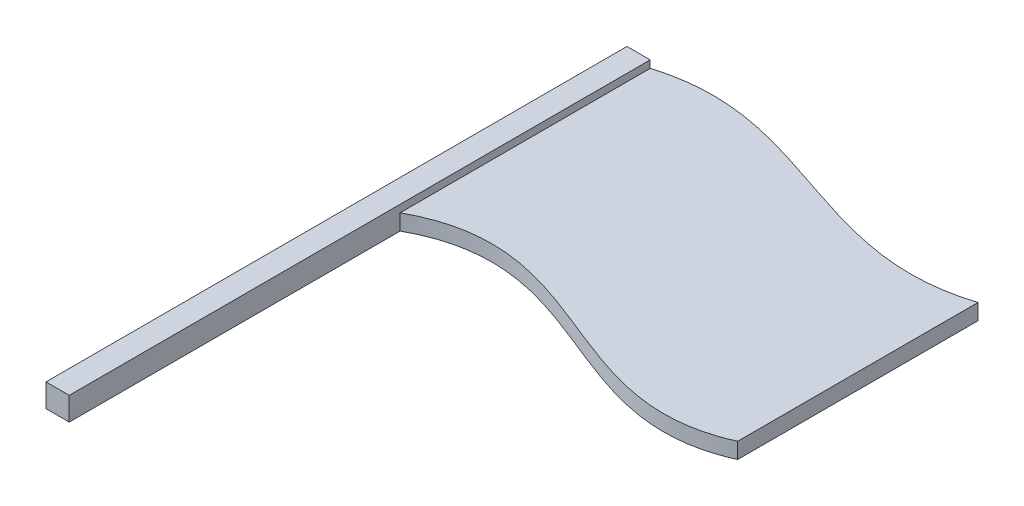
ISO-10303-21;
HEADER;
FILE_DESCRIPTION(('STEP AP214'),'2;1');
FILE_NAME('part.step','',(''),(''),'','','');
FILE_SCHEMA(('AUTOMOTIVE_DESIGN { 1 0 10303 214 1 1 1 1 }'));
ENDSEC;
DATA;
#1=APPLICATION_CONTEXT('core data for automotive mechanical design processes');
#2=APPLICATION_PROTOCOL_DEFINITION('international standard','automotive_design',2000,#1);
#3=PRODUCT_CONTEXT('',#1,'mechanical');
#4=PRODUCT('Part','Part','',(#3));
#5=PRODUCT_RELATED_PRODUCT_CATEGORY('part','',(#4));
#6=PRODUCT_DEFINITION_FORMATION('','',#4);
#7=PRODUCT_DEFINITION_CONTEXT('part definition',#1,'design');
#8=PRODUCT_DEFINITION('design','',#6,#7);
#9=PRODUCT_DEFINITION_SHAPE('','',#8);
#10=(LENGTH_UNIT() NAMED_UNIT(*) SI_UNIT(.MILLI.,.METRE.));
#11=(NAMED_UNIT(*) PLANE_ANGLE_UNIT() SI_UNIT($,.RADIAN.));
#12=(NAMED_UNIT(*) SI_UNIT($,.STERADIAN.) SOLID_ANGLE_UNIT());
#13=UNCERTAINTY_MEASURE_WITH_UNIT(LENGTH_MEASURE(1.E-05),#10,'distance_accuracy_value','');
#14=(GEOMETRIC_REPRESENTATION_CONTEXT(3) GLOBAL_UNCERTAINTY_ASSIGNED_CONTEXT((#13)) GLOBAL_UNIT_ASSIGNED_CONTEXT((#10,
#11,#12)) REPRESENTATION_CONTEXT('',''));
#15=CARTESIAN_POINT('',(0.,0.,0.));
#16=DIRECTION('',(0.,0.,1.));
#17=DIRECTION('',(1.,0.,0.));
#18=AXIS2_PLACEMENT_3D('',#15,#16,#17);
#19=CARTESIAN_POINT('',(2.2,2.2,0.));
#20=DIRECTION('',(-1.,0.,0.));
#21=DIRECTION('',(0.,0.,1.));
#22=AXIS2_PLACEMENT_3D('',#19,#20,#21);
#23=PLANE('',#22);
#24=DIRECTION('',(0.,-1.,0.));
#25=VECTOR('',#24,1.);
#26=CARTESIAN_POINT('',(2.2,1.5,-31.323116724792));
#27=LINE('',#26,#25);
#28=CARTESIAN_POINT('',(2.2,1.5,-31.323116724792));
#29=VERTEX_POINT('',#28);
#30=CARTESIAN_POINT('',(2.2,0.,-31.323116724792));
#31=VERTEX_POINT('',#30);
#32=EDGE_CURVE('E104',#29,#31,#27,.T.);
#33=ORIENTED_EDGE('',*,*,#32,.F.);
#34=DIRECTION('',(0.,0.,1.));
#35=VECTOR('',#34,1.);
#36=CARTESIAN_POINT('',(2.2,1.5,-55.));
#37=LINE('',#36,#35);
#38=CARTESIAN_POINT('',(2.2,1.5,-55.));
#39=VERTEX_POINT('',#38);
#40=EDGE_CURVE('E59',#39,#29,#37,.T.);
#41=ORIENTED_EDGE('',*,*,#40,.F.);
#42=DIRECTION('',(0.,-1.,0.));
#43=VECTOR('',#42,1.);
#44=CARTESIAN_POINT('',(2.2,2.2,-55.));
#45=LINE('',#44,#43);
#46=CARTESIAN_POINT('',(2.2,2.2,-55.));
#47=VERTEX_POINT('',#46);
#48=EDGE_CURVE('E208',#47,#39,#45,.T.);
#49=ORIENTED_EDGE('',*,*,#48,.F.);
#50=DIRECTION('',(0.,0.,-1.));
#51=VECTOR('',#50,1.);
#52=CARTESIAN_POINT('',(2.2,2.2,0.));
#53=LINE('',#52,#51);
#54=CARTESIAN_POINT('',(2.2,2.2,0.));
#55=VERTEX_POINT('',#54);
#56=EDGE_CURVE('E188',#55,#47,#53,.T.);
#57=ORIENTED_EDGE('',*,*,#56,.F.);
#58=DIRECTION('',(0.,-1.,0.));
#59=VECTOR('',#58,1.);
#60=CARTESIAN_POINT('',(2.2,2.2,0.));
#61=LINE('',#60,#59);
#62=CARTESIAN_POINT('',(2.2,0.,0.));
#63=VERTEX_POINT('',#62);
#64=EDGE_CURVE('E52',#55,#63,#61,.T.);
#65=ORIENTED_EDGE('',*,*,#64,.T.);
#66=DIRECTION('',(0.,0.,-1.));
#67=VECTOR('',#66,1.);
#68=CARTESIAN_POINT('',(2.2,0.,0.));
#69=LINE('',#68,#67);
#70=EDGE_CURVE('E65',#63,#31,#69,.T.);
#71=ORIENTED_EDGE('',*,*,#70,.T.);
#72=EDGE_LOOP('',(#33,#41,#49,#57,#65,#71));
#73=FACE_BOUND('',#72,.T.);
#74=ADVANCED_FACE('F43',(#73),#23,.F.);
#75=CARTESIAN_POINT('',(0.,2.2,0.));
#76=DIRECTION('',(1.,0.,0.));
#77=DIRECTION('',(0.,0.,-1.));
#78=AXIS2_PLACEMENT_3D('',#75,#76,#77);
#79=PLANE('',#78);
#80=DIRECTION('',(0.,0.,1.));
#81=VECTOR('',#80,1.);
#82=CARTESIAN_POINT('',(0.,0.,0.));
#83=LINE('',#82,#81);
#84=CARTESIAN_POINT('',(0.,0.,-55.));
#85=VERTEX_POINT('',#84);
#86=CARTESIAN_POINT('',(0.,0.,0.));
#87=VERTEX_POINT('',#86);
#88=EDGE_CURVE('E179',#85,#87,#83,.T.);
#89=ORIENTED_EDGE('',*,*,#88,.T.);
#90=DIRECTION('',(0.,-1.,0.));
#91=VECTOR('',#90,1.);
#92=CARTESIAN_POINT('',(0.,2.2,0.));
#93=LINE('',#92,#91);
#94=CARTESIAN_POINT('',(0.,2.2,0.));
#95=VERTEX_POINT('',#94);
#96=EDGE_CURVE('E11',#95,#87,#93,.T.);
#97=ORIENTED_EDGE('',*,*,#96,.F.);
#98=DIRECTION('',(0.,0.,1.));
#99=VECTOR('',#98,1.);
#100=CARTESIAN_POINT('',(0.,2.2,0.));
#101=LINE('',#100,#99);
#102=CARTESIAN_POINT('',(0.,2.2,-55.));
#103=VERTEX_POINT('',#102);
#104=EDGE_CURVE('E180',#103,#95,#101,.T.);
#105=ORIENTED_EDGE('',*,*,#104,.F.);
#106=DIRECTION('',(0.,-1.,0.));
#107=VECTOR('',#106,1.);
#108=CARTESIAN_POINT('',(0.,2.2,-55.));
#109=LINE('',#108,#107);
#110=EDGE_CURVE('E194',#103,#85,#109,.T.);
#111=ORIENTED_EDGE('',*,*,#110,.T.);
#112=EDGE_LOOP('',(#89,#97,#105,#111));
#113=FACE_BOUND('',#112,.T.);
#114=ADVANCED_FACE('F45',(#113),#79,.F.);
#115=CARTESIAN_POINT('',(0.,2.2,0.));
#116=DIRECTION('',(0.,0.,-1.));
#117=DIRECTION('',(-1.,0.,0.));
#118=AXIS2_PLACEMENT_3D('',#115,#116,#117);
#119=PLANE('',#118);
#120=DIRECTION('',(1.,0.,0.));
#121=VECTOR('',#120,1.);
#122=CARTESIAN_POINT('',(0.,0.,0.));
#123=LINE('',#122,#121);
#124=EDGE_CURVE('E198',#87,#63,#123,.T.);
#125=ORIENTED_EDGE('',*,*,#124,.T.);
#126=ORIENTED_EDGE('',*,*,#64,.F.);
#127=DIRECTION('',(1.,0.,0.));
#128=VECTOR('',#127,1.);
#129=CARTESIAN_POINT('',(0.,2.2,0.));
#130=LINE('',#129,#128);
#131=EDGE_CURVE('E184',#95,#55,#130,.T.);
#132=ORIENTED_EDGE('',*,*,#131,.F.);
#133=ORIENTED_EDGE('',*,*,#96,.T.);
#134=EDGE_LOOP('',(#125,#126,#132,#133));
#135=FACE_BOUND('',#134,.T.);
#136=ADVANCED_FACE('F227',(#135),#119,.F.);
#137=CARTESIAN_POINT('',(0.,2.2,-55.));
#138=DIRECTION('',(0.,0.,1.));
#139=DIRECTION('',(1.,0.,0.));
#140=AXIS2_PLACEMENT_3D('',#137,#138,#139);
#141=PLANE('',#140);
#142=DIRECTION('',(-1.,0.,0.));
#143=VECTOR('',#142,1.);
#144=CARTESIAN_POINT('',(0.,0.,-55.));
#145=LINE('',#144,#143);
#146=CARTESIAN_POINT('',(2.2,0.,-55.));
#147=VERTEX_POINT('',#146);
#148=EDGE_CURVE('E185',#147,#85,#145,.T.);
#149=ORIENTED_EDGE('',*,*,#148,.T.);
#150=ORIENTED_EDGE('',*,*,#110,.F.);
#151=DIRECTION('',(-1.,0.,0.));
#152=VECTOR('',#151,1.);
#153=CARTESIAN_POINT('',(0.,2.2,-55.));
#154=LINE('',#153,#152);
#155=EDGE_CURVE('E191',#47,#103,#154,.T.);
#156=ORIENTED_EDGE('',*,*,#155,.F.);
#157=ORIENTED_EDGE('',*,*,#48,.T.);
#158=DIRECTION('',(0.,-1.,0.));
#159=VECTOR('',#158,1.);
#160=CARTESIAN_POINT('',(2.2,1.5,-55.));
#161=LINE('',#160,#159);
#162=EDGE_CURVE('E109',#39,#147,#161,.T.);
#163=ORIENTED_EDGE('',*,*,#162,.T.);
#164=EDGE_LOOP('',(#149,#150,#156,#157,#163));
#165=FACE_BOUND('',#164,.T.);
#166=ADVANCED_FACE('F220',(#165),#141,.F.);
#167=CARTESIAN_POINT('',(0.,2.2,0.));
#168=DIRECTION('',(0.,-1.,0.));
#169=DIRECTION('',(0.,0.,-1.));
#170=AXIS2_PLACEMENT_3D('',#167,#168,#169);
#171=PLANE('',#170);
#172=ORIENTED_EDGE('',*,*,#104,.T.);
#173=ORIENTED_EDGE('',*,*,#131,.T.);
#174=ORIENTED_EDGE('',*,*,#56,.T.);
#175=ORIENTED_EDGE('',*,*,#155,.T.);
#176=EDGE_LOOP('',(#172,#173,#174,#175));
#177=FACE_BOUND('',#176,.T.);
#178=ADVANCED_FACE('F150',(#177),#171,.F.);
#179=CARTESIAN_POINT('',(0.,0.,0.));
#180=DIRECTION('',(0.,-1.,0.));
#181=DIRECTION('',(0.,0.,-1.));
#182=AXIS2_PLACEMENT_3D('',#179,#180,#181);
#183=PLANE('',#182);
#184=ORIENTED_EDGE('',*,*,#88,.F.);
#185=ORIENTED_EDGE('',*,*,#148,.F.);
#186=CARTESIAN_POINT('',(36.9061950367362,0.,-51.3261210531367));
#187=CARTESIAN_POINT('',(24.5057977795233,0.,-47.3439413086352));
#188=CARTESIAN_POINT('',(14.2965385767881,0.,-58.7638170369596));
#189=CARTESIAN_POINT('',(2.2,0.,-55.));
#190=B_SPLINE_CURVE_WITH_KNOTS('',3,(#186,#187,#188,#189),.UNSPECIFIED.,.F.,.F.,(4,4),(0.,1.),.UNSPECIFIED.);
#191=CARTESIAN_POINT('',(36.9061950367362,0.,-51.3261210531367));
#192=VERTEX_POINT('',#191);
#193=EDGE_CURVE('E168',#192,#147,#190,.T.);
#194=ORIENTED_EDGE('',*,*,#193,.F.);
#195=DIRECTION('',(0.,0.,-1.));
#196=VECTOR('',#195,1.);
#197=CARTESIAN_POINT('',(36.9061950367362,0.,-51.3261210531367));
#198=LINE('',#197,#196);
#199=CARTESIAN_POINT('',(36.9061950367362,0.,-28.5716533778822));
#200=VERTEX_POINT('',#199);
#201=EDGE_CURVE('E156',#200,#192,#198,.T.);
#202=ORIENTED_EDGE('',*,*,#201,.F.);
#203=CARTESIAN_POINT('',(2.2,0.,-31.323116724792));
#204=CARTESIAN_POINT('',(14.5595057509905,0.,-38.1540172680351));
#205=CARTESIAN_POINT('',(24.656914199335,0.,-23.0362558905574));
#206=CARTESIAN_POINT('',(36.9061950367362,0.,-28.5716533778822));
#207=B_SPLINE_CURVE_WITH_KNOTS('',3,(#203,#204,#205,#206),.UNSPECIFIED.,.F.,.F.,(4,4),(0.,1.),.UNSPECIFIED.);
#208=EDGE_CURVE('E161',#31,#200,#207,.T.);
#209=ORIENTED_EDGE('',*,*,#208,.F.);
#210=ORIENTED_EDGE('',*,*,#70,.F.);
#211=ORIENTED_EDGE('',*,*,#124,.F.);
#212=EDGE_LOOP('',(#184,#185,#194,#202,#209,#210,#211));
#213=FACE_BOUND('',#212,.T.);
#214=ADVANCED_FACE('F148',(#213),#183,.T.);
#215=CARTESIAN_POINT('',(36.9061950367362,1.5,-51.3261210531367));
#216=CARTESIAN_POINT('',(24.5057977795233,1.5,-47.3439413086352));
#217=CARTESIAN_POINT('',(14.2965385767881,1.5,-58.7638170369596));
#218=CARTESIAN_POINT('',(2.2,1.5,-55.));
#219=B_SPLINE_CURVE_WITH_KNOTS('',3,(#215,#216,#217,#218),.UNSPECIFIED.,.F.,.F.,(4,4),(0.,1.),.UNSPECIFIED.);
#220=DIRECTION('',(0.,-1.,0.));
#221=VECTOR('',#220,1.);
#222=SURFACE_OF_LINEAR_EXTRUSION('',#219,#221);
#223=ORIENTED_EDGE('',*,*,#193,.T.);
#224=ORIENTED_EDGE('',*,*,#162,.F.);
#225=CARTESIAN_POINT('',(36.9061950367362,1.5,-51.3261210531367));
#226=VERTEX_POINT('',#225);
#227=EDGE_CURVE('E118',#226,#39,#219,.T.);
#228=ORIENTED_EDGE('',*,*,#227,.F.);
#229=DIRECTION('',(0.,-1.,0.));
#230=VECTOR('',#229,1.);
#231=CARTESIAN_POINT('',(36.9061950367362,1.5,-51.3261210531367));
#232=LINE('',#231,#230);
#233=EDGE_CURVE('E129',#226,#192,#232,.T.);
#234=ORIENTED_EDGE('',*,*,#233,.T.);
#235=EDGE_LOOP('',(#223,#224,#228,#234));
#236=FACE_BOUND('',#235,.T.);
#237=ADVANCED_FACE('F144',(#236),#222,.F.);
#238=CARTESIAN_POINT('',(2.2,1.5,-31.323116724792));
#239=CARTESIAN_POINT('',(14.5595057509905,1.5,-38.1540172680351));
#240=CARTESIAN_POINT('',(24.656914199335,1.5,-23.0362558905574));
#241=CARTESIAN_POINT('',(36.9061950367362,1.5,-28.5716533778822));
#242=B_SPLINE_CURVE_WITH_KNOTS('',3,(#238,#239,#240,#241),.UNSPECIFIED.,.F.,.F.,(4,4),(0.,1.),.UNSPECIFIED.);
#243=DIRECTION('',(0.,-1.,0.));
#244=VECTOR('',#243,1.);
#245=SURFACE_OF_LINEAR_EXTRUSION('',#242,#244);
#246=ORIENTED_EDGE('',*,*,#208,.T.);
#247=DIRECTION('',(0.,-1.,0.));
#248=VECTOR('',#247,1.);
#249=CARTESIAN_POINT('',(36.9061950367362,1.5,-28.5716533778822));
#250=LINE('',#249,#248);
#251=CARTESIAN_POINT('',(36.9061950367362,1.5,-28.5716533778822));
#252=VERTEX_POINT('',#251);
#253=EDGE_CURVE('E110',#252,#200,#250,.T.);
#254=ORIENTED_EDGE('',*,*,#253,.F.);
#255=EDGE_CURVE('E115',#29,#252,#242,.T.);
#256=ORIENTED_EDGE('',*,*,#255,.F.);
#257=ORIENTED_EDGE('',*,*,#32,.T.);
#258=EDGE_LOOP('',(#246,#254,#256,#257));
#259=FACE_BOUND('',#258,.T.);
#260=ADVANCED_FACE('F122',(#259),#245,.F.);
#261=CARTESIAN_POINT('',(36.9061950367362,1.5,-51.3261210531367));
#262=DIRECTION('',(-1.,0.,0.));
#263=DIRECTION('',(0.,0.,1.));
#264=AXIS2_PLACEMENT_3D('',#261,#262,#263);
#265=PLANE('',#264);
#266=ORIENTED_EDGE('',*,*,#201,.T.);
#267=ORIENTED_EDGE('',*,*,#233,.F.);
#268=DIRECTION('',(0.,0.,-1.));
#269=VECTOR('',#268,1.);
#270=CARTESIAN_POINT('',(36.9061950367362,1.5,-51.3261210531367));
#271=LINE('',#270,#269);
#272=EDGE_CURVE('E126',#252,#226,#271,.T.);
#273=ORIENTED_EDGE('',*,*,#272,.F.);
#274=ORIENTED_EDGE('',*,*,#253,.T.);
#275=EDGE_LOOP('',(#266,#267,#273,#274));
#276=FACE_BOUND('',#275,.T.);
#277=ADVANCED_FACE('F143',(#276),#265,.F.);
#278=CARTESIAN_POINT('',(19.4391505132088,1.5,-53.0811745112401));
#279=DIRECTION('',(0.,1.,0.));
#280=DIRECTION('',(0.,0.,1.));
#281=AXIS2_PLACEMENT_3D('',#278,#279,#280);
#282=PLANE('',#281);
#283=ORIENTED_EDGE('',*,*,#227,.T.);
#284=ORIENTED_EDGE('',*,*,#40,.T.);
#285=ORIENTED_EDGE('',*,*,#255,.T.);
#286=ORIENTED_EDGE('',*,*,#272,.T.);
#287=EDGE_LOOP('',(#283,#284,#285,#286));
#288=FACE_BOUND('',#287,.T.);
#289=ADVANCED_FACE('F114',(#288),#282,.T.);
#290=CLOSED_SHELL('',(#74,#114,#136,#166,#178,#214,#237,#260,#277,#289));
#291=MANIFOLD_SOLID_BREP('B2',#290);
#292=ADVANCED_BREP_SHAPE_REPRESENTATION('',(#18,#291),#14);
#293=SHAPE_DEFINITION_REPRESENTATION(#9,#292);
ENDSEC;
END-ISO-10303-21;
